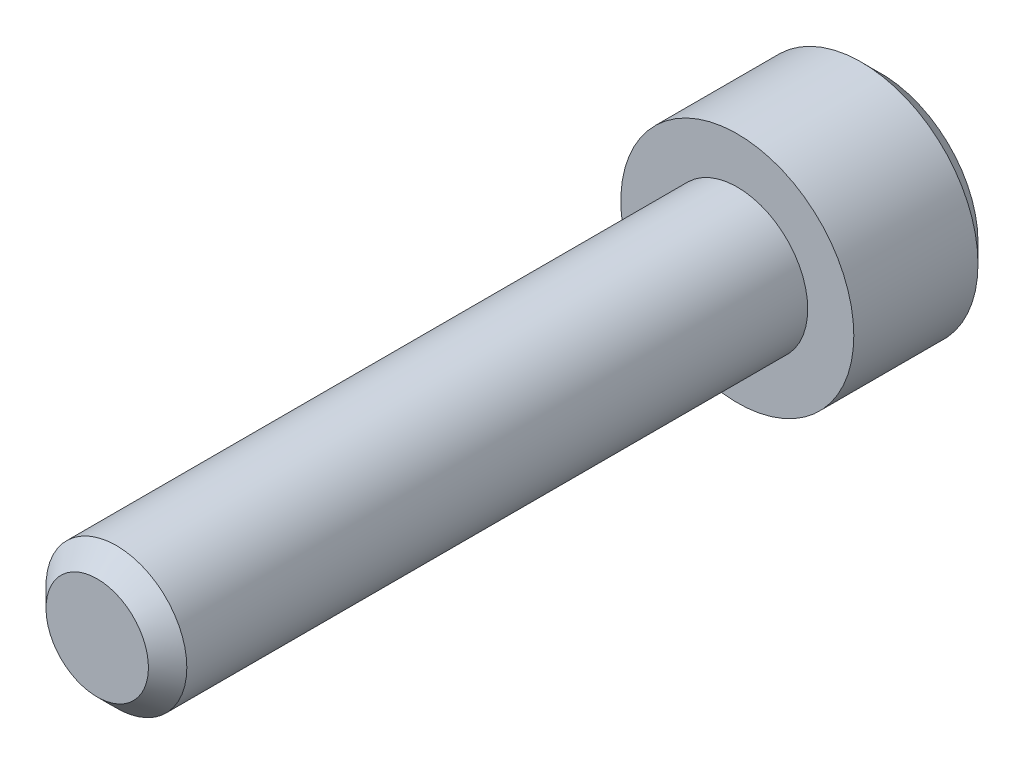
ISO-10303-21;
HEADER;
FILE_DESCRIPTION(('STEP AP214'),'2;1');
FILE_NAME('part.step','',(''),(''),'','','');
FILE_SCHEMA(('AUTOMOTIVE_DESIGN { 1 0 10303 214 1 1 1 1 }'));
ENDSEC;
DATA;
#1=APPLICATION_CONTEXT('core data for automotive mechanical design processes');
#2=APPLICATION_PROTOCOL_DEFINITION('international standard','automotive_design',2000,#1);
#3=PRODUCT_CONTEXT('',#1,'mechanical');
#4=PRODUCT('Part','Part','',(#3));
#5=PRODUCT_RELATED_PRODUCT_CATEGORY('part','',(#4));
#6=PRODUCT_DEFINITION_FORMATION('','',#4);
#7=PRODUCT_DEFINITION_CONTEXT('part definition',#1,'design');
#8=PRODUCT_DEFINITION('design','',#6,#7);
#9=PRODUCT_DEFINITION_SHAPE('','',#8);
#10=(LENGTH_UNIT() NAMED_UNIT(*) SI_UNIT(.MILLI.,.METRE.));
#11=(NAMED_UNIT(*) PLANE_ANGLE_UNIT() SI_UNIT($,.RADIAN.));
#12=(NAMED_UNIT(*) SI_UNIT($,.STERADIAN.) SOLID_ANGLE_UNIT());
#13=UNCERTAINTY_MEASURE_WITH_UNIT(LENGTH_MEASURE(1.E-05),#10,'distance_accuracy_value','');
#14=(GEOMETRIC_REPRESENTATION_CONTEXT(3) GLOBAL_UNCERTAINTY_ASSIGNED_CONTEXT((#13)) GLOBAL_UNIT_ASSIGNED_CONTEXT((#10,
#11,#12)) REPRESENTATION_CONTEXT('',''));
#15=CARTESIAN_POINT('',(0.,0.,0.));
#16=DIRECTION('',(0.,0.,1.));
#17=DIRECTION('',(1.,0.,0.));
#18=AXIS2_PLACEMENT_3D('',#15,#16,#17);
#19=CARTESIAN_POINT('',(0.,0.,0.));
#20=DIRECTION('',(0.,0.,-1.));
#21=DIRECTION('',(-1.,0.,0.));
#22=AXIS2_PLACEMENT_3D('',#19,#20,#21);
#23=PLANE('',#22);
#24=CARTESIAN_POINT('',(0.,0.,0.));
#25=DIRECTION('',(0.,0.,1.));
#26=DIRECTION('',(1.,0.,0.));
#27=AXIS2_PLACEMENT_3D('',#24,#25,#26);
#28=CIRCLE('',#27,1.93039999993515);
#29=CARTESIAN_POINT('',(1.93039999993516,0.,0.));
#30=VERTEX_POINT('',#29);
#31=EDGE_CURVE('E18',#30,#30,#28,.T.);
#32=ORIENTED_EDGE('',*,*,#31,.F.);
#33=EDGE_LOOP('',(#32));
#34=FACE_BOUND('',#33,.T.);
#35=ADVANCED_FACE('F15',(#34),#23,.T.);
#36=CARTESIAN_POINT('',(0.,0.,0.381000000061249));
#37=DIRECTION('',(0.,0.,1.));
#38=DIRECTION('',(1.,0.,0.));
#39=AXIS2_PLACEMENT_3D('',#36,#37,#38);
#40=CONICAL_SURFACE('',#39,2.3113999999964,0.785398163397448);
#41=ORIENTED_EDGE('',*,*,#31,.T.);
#42=EDGE_LOOP('',(#41));
#43=FACE_BOUND('',#42,.T.);
#44=CARTESIAN_POINT('',(0.,0.,0.381));
#45=DIRECTION('',(0.,0.,1.));
#46=DIRECTION('',(1.,0.,0.));
#47=AXIS2_PLACEMENT_3D('',#44,#45,#46);
#48=CIRCLE('',#47,2.3114);
#49=CARTESIAN_POINT('',(2.31140000000001,0.,0.381));
#50=VERTEX_POINT('',#49);
#51=EDGE_CURVE('E36',#50,#50,#48,.T.);
#52=ORIENTED_EDGE('',*,*,#51,.F.);
#53=EDGE_LOOP('',(#52));
#54=FACE_BOUND('',#53,.T.);
#55=ADVANCED_FACE('F47',(#43,#54),#40,.T.);
#56=CARTESIAN_POINT('',(0.,0.,15.5448));
#57=DIRECTION('',(0.,0.,-1.));
#58=DIRECTION('',(-1.,0.,0.));
#59=AXIS2_PLACEMENT_3D('',#56,#57,#58);
#60=PLANE('',#59);
#61=CARTESIAN_POINT('',(0.,0.,15.5447999999865));
#62=DIRECTION('',(0.,0.,-1.));
#63=DIRECTION('',(0.,1.,0.));
#64=AXIS2_PLACEMENT_3D('',#61,#62,#63);
#65=CIRCLE('',#64,1.0159999999928);
#66=CARTESIAN_POINT('',(0.,1.01599999999281,15.5447999999865));
#67=VERTEX_POINT('',#66);
#68=EDGE_CURVE('E34',#67,#67,#65,.T.);
#69=ORIENTED_EDGE('',*,*,#68,.F.);
#70=EDGE_LOOP('',(#69));
#71=FACE_BOUND('',#70,.T.);
#72=ADVANCED_FACE('F55',(#71),#60,.F.);
#73=CARTESIAN_POINT('',(0.,0.,2.8448));
#74=DIRECTION('',(0.,0.,1.));
#75=DIRECTION('',(1.,0.,0.));
#76=AXIS2_PLACEMENT_3D('',#73,#74,#75);
#77=CYLINDRICAL_SURFACE('',#76,2.3114);
#78=CARTESIAN_POINT('',(0.,0.,2.8448));
#79=DIRECTION('',(0.,0.,1.));
#80=DIRECTION('',(1.,0.,0.));
#81=AXIS2_PLACEMENT_3D('',#78,#79,#80);
#82=CIRCLE('',#81,2.3114);
#83=CARTESIAN_POINT('',(2.31140000000001,0.,2.8448));
#84=VERTEX_POINT('',#83);
#85=EDGE_CURVE('E27',#84,#84,#82,.F.);
#86=ORIENTED_EDGE('',*,*,#85,.T.);
#87=EDGE_LOOP('',(#86));
#88=FACE_BOUND('',#87,.T.);
#89=ORIENTED_EDGE('',*,*,#51,.T.);
#90=EDGE_LOOP('',(#89));
#91=FACE_BOUND('',#90,.T.);
#92=ADVANCED_FACE('F70',(#88,#91),#77,.T.);
#93=CARTESIAN_POINT('',(0.,0.,15.1637999999252));
#94=DIRECTION('',(0.,0.,-1.));
#95=DIRECTION('',(0.,1.,0.));
#96=AXIS2_PLACEMENT_3D('',#93,#94,#95);
#97=CONICAL_SURFACE('',#96,1.39700000005405,0.785398163397448);
#98=CARTESIAN_POINT('',(0.,0.,15.1638));
#99=DIRECTION('',(0.,0.,1.));
#100=DIRECTION('',(1.,0.,0.));
#101=AXIS2_PLACEMENT_3D('',#98,#99,#100);
#102=CIRCLE('',#101,1.397);
#103=CARTESIAN_POINT('',(1.397,0.,15.1638));
#104=VERTEX_POINT('',#103);
#105=EDGE_CURVE('E22',#104,#104,#102,.F.);
#106=ORIENTED_EDGE('',*,*,#105,.F.);
#107=EDGE_LOOP('',(#106));
#108=FACE_BOUND('',#107,.T.);
#109=ORIENTED_EDGE('',*,*,#68,.T.);
#110=EDGE_LOOP('',(#109));
#111=FACE_BOUND('',#110,.T.);
#112=ADVANCED_FACE('F63',(#108,#111),#97,.T.);
#113=CARTESIAN_POINT('',(0.,0.,2.8448));
#114=DIRECTION('',(0.,0.,-1.));
#115=DIRECTION('',(-1.,0.,0.));
#116=AXIS2_PLACEMENT_3D('',#113,#114,#115);
#117=PLANE('',#116);
#118=ORIENTED_EDGE('',*,*,#85,.F.);
#119=EDGE_LOOP('',(#118));
#120=FACE_BOUND('',#119,.T.);
#121=CARTESIAN_POINT('',(0.,0.,2.8448));
#122=DIRECTION('',(0.,0.,1.));
#123=DIRECTION('',(1.,0.,0.));
#124=AXIS2_PLACEMENT_3D('',#121,#122,#123);
#125=CIRCLE('',#124,1.397);
#126=CARTESIAN_POINT('',(1.397,0.,2.8448));
#127=VERTEX_POINT('',#126);
#128=EDGE_CURVE('E10',#127,#127,#125,.T.);
#129=ORIENTED_EDGE('',*,*,#128,.F.);
#130=EDGE_LOOP('',(#129));
#131=FACE_BOUND('',#130,.T.);
#132=ADVANCED_FACE('F58',(#120,#131),#117,.F.);
#133=CARTESIAN_POINT('',(0.,0.,15.5448));
#134=DIRECTION('',(0.,0.,1.));
#135=DIRECTION('',(1.,0.,0.));
#136=AXIS2_PLACEMENT_3D('',#133,#134,#135);
#137=CYLINDRICAL_SURFACE('',#136,1.397);
#138=ORIENTED_EDGE('',*,*,#128,.T.);
#139=EDGE_LOOP('',(#138));
#140=FACE_BOUND('',#139,.T.);
#141=ORIENTED_EDGE('',*,*,#105,.T.);
#142=EDGE_LOOP('',(#141));
#143=FACE_BOUND('',#142,.T.);
#144=ADVANCED_FACE('F56',(#140,#143),#137,.T.);
#145=CLOSED_SHELL('',(#35,#55,#72,#92,#112,#132,#144));
#146=MANIFOLD_SOLID_BREP('B1',#145);
#147=ADVANCED_BREP_SHAPE_REPRESENTATION('',(#18,#146),#14);
#148=SHAPE_DEFINITION_REPRESENTATION(#9,#147);
ENDSEC;
END-ISO-10303-21;
